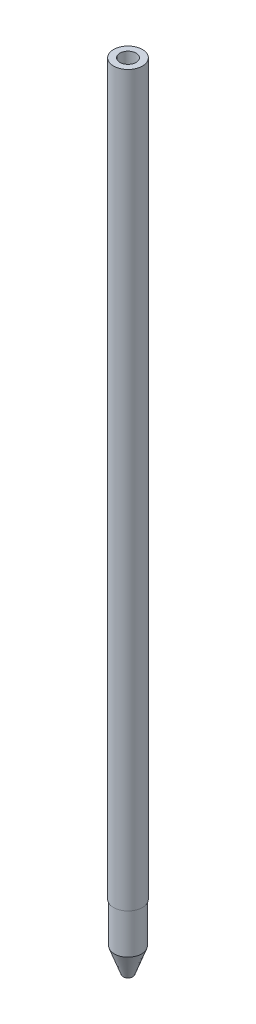
ISO-10303-21;
HEADER;
FILE_DESCRIPTION(('STEP AP214'),'2;1');
FILE_NAME('part.step','',(''),(''),'','','');
FILE_SCHEMA(('AUTOMOTIVE_DESIGN { 1 0 10303 214 1 1 1 1 }'));
ENDSEC;
DATA;
#1=APPLICATION_CONTEXT('core data for automotive mechanical design processes');
#2=APPLICATION_PROTOCOL_DEFINITION('international standard','automotive_design',2000,#1);
#3=PRODUCT_CONTEXT('',#1,'mechanical');
#4=PRODUCT('Part','Part','',(#3));
#5=PRODUCT_RELATED_PRODUCT_CATEGORY('part','',(#4));
#6=PRODUCT_DEFINITION_FORMATION('','',#4);
#7=PRODUCT_DEFINITION_CONTEXT('part definition',#1,'design');
#8=PRODUCT_DEFINITION('design','',#6,#7);
#9=PRODUCT_DEFINITION_SHAPE('','',#8);
#10=(LENGTH_UNIT() NAMED_UNIT(*) SI_UNIT(.MILLI.,.METRE.));
#11=(NAMED_UNIT(*) PLANE_ANGLE_UNIT() SI_UNIT($,.RADIAN.));
#12=(NAMED_UNIT(*) SI_UNIT($,.STERADIAN.) SOLID_ANGLE_UNIT());
#13=UNCERTAINTY_MEASURE_WITH_UNIT(LENGTH_MEASURE(1.E-05),#10,'distance_accuracy_value','');
#14=(GEOMETRIC_REPRESENTATION_CONTEXT(3) GLOBAL_UNCERTAINTY_ASSIGNED_CONTEXT((#13)) GLOBAL_UNIT_ASSIGNED_CONTEXT((#10,
#11,#12)) REPRESENTATION_CONTEXT('',''));
#15=CARTESIAN_POINT('',(0.,0.,0.));
#16=DIRECTION('',(0.,0.,1.));
#17=DIRECTION('',(1.,0.,0.));
#18=AXIS2_PLACEMENT_3D('',#15,#16,#17);
#19=CARTESIAN_POINT('',(0.,89.9922,0.));
#20=DIRECTION('',(0.,-1.,0.));
#21=DIRECTION('',(0.,0.,-1.));
#22=AXIS2_PLACEMENT_3D('',#19,#20,#21);
#23=CYLINDRICAL_SURFACE('',#22,1.778);
#24=CARTESIAN_POINT('',(0.,89.9922,0.));
#25=DIRECTION('',(0.,1.,0.));
#26=DIRECTION('',(0.,0.,1.));
#27=AXIS2_PLACEMENT_3D('',#24,#25,#26);
#28=CIRCLE('',#27,1.778);
#29=CARTESIAN_POINT('',(0.,89.9922,1.778));
#30=VERTEX_POINT('',#29);
#31=EDGE_CURVE('E67',#30,#30,#28,.T.);
#32=ORIENTED_EDGE('',*,*,#31,.F.);
#33=EDGE_LOOP('',(#32));
#34=FACE_BOUND('',#33,.T.);
#35=CARTESIAN_POINT('',(0.,0.,0.));
#36=DIRECTION('',(0.,1.,0.));
#37=DIRECTION('',(0.,0.,1.));
#38=AXIS2_PLACEMENT_3D('',#35,#36,#37);
#39=CIRCLE('',#38,1.778);
#40=CARTESIAN_POINT('',(0.,0.,1.778));
#41=VERTEX_POINT('',#40);
#42=EDGE_CURVE('E71',#41,#41,#39,.T.);
#43=ORIENTED_EDGE('',*,*,#42,.T.);
#44=EDGE_LOOP('',(#43));
#45=FACE_BOUND('',#44,.T.);
#46=ADVANCED_FACE('F47',(#34,#45),#23,.T.);
#47=CARTESIAN_POINT('',(0.,89.9922,0.));
#48=DIRECTION('',(0.,1.,0.));
#49=DIRECTION('',(0.,0.,1.));
#50=AXIS2_PLACEMENT_3D('',#47,#48,#49);
#51=PLANE('',#50);
#52=CARTESIAN_POINT('',(0.,89.9922,0.));
#53=DIRECTION('',(0.,1.,0.));
#54=DIRECTION('',(0.,0.,1.));
#55=AXIS2_PLACEMENT_3D('',#52,#53,#54);
#56=CIRCLE('',#55,0.99949);
#57=CARTESIAN_POINT('',(0.,89.9922,0.99949));
#58=VERTEX_POINT('',#57);
#59=EDGE_CURVE('E61',#58,#58,#56,.T.);
#60=ORIENTED_EDGE('',*,*,#59,.F.);
#61=EDGE_LOOP('',(#60));
#62=FACE_BOUND('',#61,.T.);
#63=ORIENTED_EDGE('',*,*,#31,.T.);
#64=EDGE_LOOP('',(#63));
#65=FACE_BOUND('',#64,.T.);
#66=ADVANCED_FACE('F82',(#62,#65),#51,.T.);
#67=CARTESIAN_POINT('',(0.,0.,0.));
#68=DIRECTION('',(0.,1.,0.));
#69=DIRECTION('',(0.,0.,1.));
#70=AXIS2_PLACEMENT_3D('',#67,#68,#69);
#71=PLANE('',#70);
#72=CARTESIAN_POINT('',(0.,0.,0.));
#73=DIRECTION('',(0.,1.,0.));
#74=DIRECTION('',(0.,0.,1.));
#75=AXIS2_PLACEMENT_3D('',#72,#73,#74);
#76=CIRCLE('',#75,1.7526);
#77=CARTESIAN_POINT('',(0.,0.,1.7526));
#78=VERTEX_POINT('',#77);
#79=EDGE_CURVE('E59',#78,#78,#76,.F.);
#80=ORIENTED_EDGE('',*,*,#79,.F.);
#81=EDGE_LOOP('',(#80));
#82=FACE_BOUND('',#81,.T.);
#83=ORIENTED_EDGE('',*,*,#42,.F.);
#84=EDGE_LOOP('',(#83));
#85=FACE_BOUND('',#84,.T.);
#86=ADVANCED_FACE('F79',(#82,#85),#71,.F.);
#87=CARTESIAN_POINT('',(0.,2.99720000000001,0.));
#88=DIRECTION('',(0.,1.,0.));
#89=DIRECTION('',(0.,0.,1.));
#90=AXIS2_PLACEMENT_3D('',#87,#88,#89);
#91=CYLINDRICAL_SURFACE('',#90,0.99949);
#92=CARTESIAN_POINT('',(0.,2.99720000000001,0.));
#93=DIRECTION('',(0.,1.,0.));
#94=DIRECTION('',(0.,0.,1.));
#95=AXIS2_PLACEMENT_3D('',#92,#93,#94);
#96=CIRCLE('',#95,0.99949);
#97=CARTESIAN_POINT('',(0.,2.99720000000001,0.99949));
#98=VERTEX_POINT('',#97);
#99=EDGE_CURVE('E11',#98,#98,#96,.T.);
#100=ORIENTED_EDGE('',*,*,#99,.F.);
#101=EDGE_LOOP('',(#100));
#102=FACE_BOUND('',#101,.T.);
#103=ORIENTED_EDGE('',*,*,#59,.T.);
#104=EDGE_LOOP('',(#103));
#105=FACE_BOUND('',#104,.T.);
#106=ADVANCED_FACE('F81',(#102,#105),#91,.F.);
#107=CARTESIAN_POINT('',(0.,-4.95710137883017,0.));
#108=DIRECTION('',(0.,1.,0.));
#109=DIRECTION('',(0.,0.,1.));
#110=AXIS2_PLACEMENT_3D('',#107,#108,#109);
#111=CYLINDRICAL_SURFACE('',#110,1.7526);
#112=ORIENTED_EDGE('',*,*,#79,.T.);
#113=EDGE_LOOP('',(#112));
#114=FACE_BOUND('',#113,.T.);
#115=CARTESIAN_POINT('',(0.,2.9972,0.));
#116=DIRECTION('',(0.,1.,0.));
#117=DIRECTION('',(0.,0.,1.));
#118=AXIS2_PLACEMENT_3D('',#115,#116,#117);
#119=CIRCLE('',#118,1.7526);
#120=CARTESIAN_POINT('',(0.,2.9972,1.7526));
#121=VERTEX_POINT('',#120);
#122=EDGE_CURVE('E51',#121,#121,#119,.T.);
#123=ORIENTED_EDGE('',*,*,#122,.T.);
#124=EDGE_LOOP('',(#123));
#125=FACE_BOUND('',#124,.T.);
#126=ADVANCED_FACE('F89',(#114,#125),#111,.F.);
#127=CARTESIAN_POINT('',(0.,2.9972,0.));
#128=DIRECTION('',(0.,1.,0.));
#129=DIRECTION('',(0.,0.,1.));
#130=AXIS2_PLACEMENT_3D('',#127,#128,#129);
#131=PLANE('',#130);
#132=ORIENTED_EDGE('',*,*,#99,.T.);
#133=EDGE_LOOP('',(#132));
#134=FACE_BOUND('',#133,.T.);
#135=ORIENTED_EDGE('',*,*,#122,.F.);
#136=EDGE_LOOP('',(#135));
#137=FACE_BOUND('',#136,.T.);
#138=ADVANCED_FACE('F49',(#134,#137),#131,.F.);
#139=CLOSED_SHELL('',(#46,#66,#86,#106,#126,#138));
#140=MANIFOLD_SOLID_BREP('B2',#139);
#141=CARTESIAN_POINT('',(0.,-5.0038,0.));
#142=DIRECTION('',(0.,1.,0.));
#143=DIRECTION('',(0.,0.,1.));
#144=AXIS2_PLACEMENT_3D('',#141,#142,#143);
#145=CYLINDRICAL_SURFACE('',#144,1.6891);
#146=CARTESIAN_POINT('',(0.,-5.0038,0.));
#147=DIRECTION('',(0.,1.,0.));
#148=DIRECTION('',(0.,0.,1.));
#149=AXIS2_PLACEMENT_3D('',#146,#147,#148);
#150=CIRCLE('',#149,1.6891);
#151=CARTESIAN_POINT('',(0.,-5.0038,1.6891));
#152=VERTEX_POINT('',#151);
#153=EDGE_CURVE('E151',#152,#152,#150,.T.);
#154=ORIENTED_EDGE('',*,*,#153,.T.);
#155=EDGE_LOOP('',(#154));
#156=FACE_BOUND('',#155,.T.);
#157=CARTESIAN_POINT('',(0.,0.,0.));
#158=DIRECTION('',(0.,1.,0.));
#159=DIRECTION('',(0.,0.,1.));
#160=AXIS2_PLACEMENT_3D('',#157,#158,#159);
#161=CIRCLE('',#160,1.6891);
#162=CARTESIAN_POINT('',(0.,0.,1.6891));
#163=VERTEX_POINT('',#162);
#164=EDGE_CURVE('E46',#163,#163,#161,.F.);
#165=ORIENTED_EDGE('',*,*,#164,.T.);
#166=EDGE_LOOP('',(#165));
#167=FACE_BOUND('',#166,.T.);
#168=ADVANCED_FACE('F141',(#156,#167),#145,.T.);
#169=CARTESIAN_POINT('',(0.,0.,0.));
#170=DIRECTION('',(0.,1.,0.));
#171=DIRECTION('',(0.,0.,1.));
#172=AXIS2_PLACEMENT_3D('',#169,#170,#171);
#173=PLANE('',#172);
#174=ORIENTED_EDGE('',*,*,#164,.F.);
#175=EDGE_LOOP('',(#174));
#176=FACE_BOUND('',#175,.T.);
#177=ADVANCED_FACE('F166',(#176),#173,.T.);
#178=CARTESIAN_POINT('',(-0.598208413857336,-8.001,0.));
#179=DIRECTION('',(0.,-1.,0.));
#180=DIRECTION('',(0.,0.,-1.));
#181=AXIS2_PLACEMENT_3D('',#178,#179,#180);
#182=PLANE('',#181);
#183=CARTESIAN_POINT('',(0.,-8.001,0.));
#184=DIRECTION('',(0.,1.,0.));
#185=DIRECTION('',(0.,0.,1.));
#186=AXIS2_PLACEMENT_3D('',#183,#184,#185);
#187=CIRCLE('',#186,0.598208413857336);
#188=CARTESIAN_POINT('',(0.,-8.001,0.598208413857336));
#189=VERTEX_POINT('',#188);
#190=EDGE_CURVE('E147',#189,#189,#187,.T.);
#191=ORIENTED_EDGE('',*,*,#190,.F.);
#192=EDGE_LOOP('',(#191));
#193=FACE_BOUND('',#192,.T.);
#194=ADVANCED_FACE('F161',(#193),#182,.T.);
#195=CARTESIAN_POINT('',(0.,-5.0038,0.));
#196=DIRECTION('',(0.,1.,0.));
#197=DIRECTION('',(0.,0.,1.));
#198=AXIS2_PLACEMENT_3D('',#195,#196,#197);
#199=CONICAL_SURFACE('',#198,1.6891,0.349065850398867);
#200=ORIENTED_EDGE('',*,*,#190,.T.);
#201=EDGE_LOOP('',(#200));
#202=FACE_BOUND('',#201,.T.);
#203=ORIENTED_EDGE('',*,*,#153,.F.);
#204=EDGE_LOOP('',(#203));
#205=FACE_BOUND('',#204,.T.);
#206=ADVANCED_FACE('F159',(#202,#205),#199,.T.);
#207=CLOSED_SHELL('',(#168,#177,#194,#206));
#208=MANIFOLD_SOLID_BREP('B6',#207);
#209=ADVANCED_BREP_SHAPE_REPRESENTATION('',(#18,#140,#208),#14);
#210=SHAPE_DEFINITION_REPRESENTATION(#9,#209);
ENDSEC;
END-ISO-10303-21;
